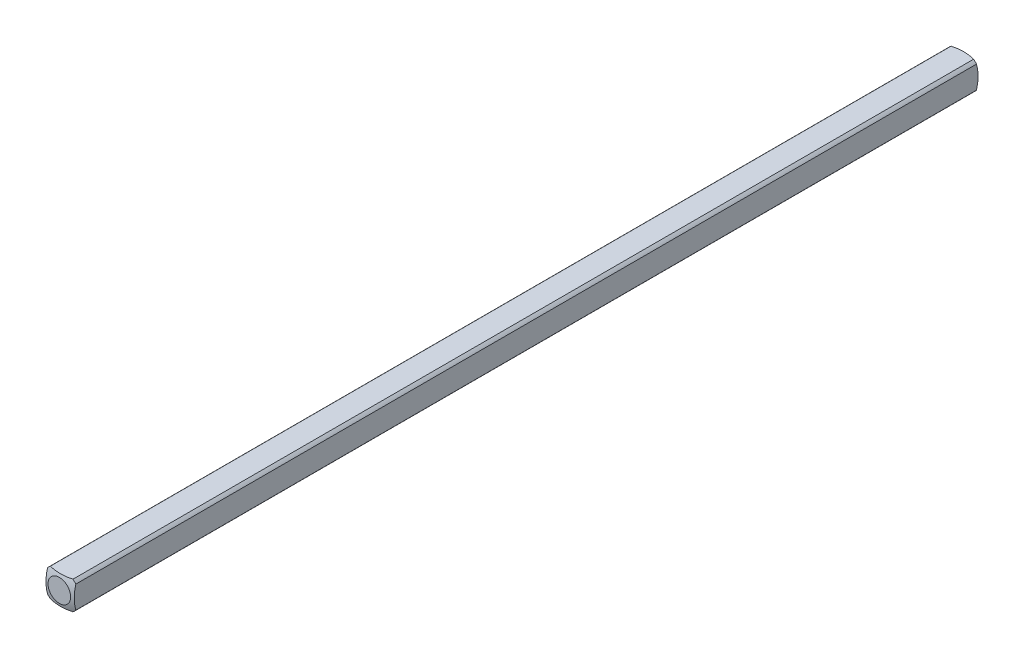
ISO-10303-21;
HEADER;
FILE_DESCRIPTION(('STEP AP214'),'2;1');
FILE_NAME('part.step','',(''),(''),'','','');
FILE_SCHEMA(('AUTOMOTIVE_DESIGN { 1 0 10303 214 1 1 1 1 }'));
ENDSEC;
DATA;
#1=APPLICATION_CONTEXT('core data for automotive mechanical design processes');
#2=APPLICATION_PROTOCOL_DEFINITION('international standard','automotive_design',2000,#1);
#3=PRODUCT_CONTEXT('',#1,'mechanical');
#4=PRODUCT('Part','Part','',(#3));
#5=PRODUCT_RELATED_PRODUCT_CATEGORY('part','',(#4));
#6=PRODUCT_DEFINITION_FORMATION('','',#4);
#7=PRODUCT_DEFINITION_CONTEXT('part definition',#1,'design');
#8=PRODUCT_DEFINITION('design','',#6,#7);
#9=PRODUCT_DEFINITION_SHAPE('','',#8);
#10=(LENGTH_UNIT() NAMED_UNIT(*) SI_UNIT(.MILLI.,.METRE.));
#11=(NAMED_UNIT(*) PLANE_ANGLE_UNIT() SI_UNIT($,.RADIAN.));
#12=(NAMED_UNIT(*) SI_UNIT($,.STERADIAN.) SOLID_ANGLE_UNIT());
#13=UNCERTAINTY_MEASURE_WITH_UNIT(LENGTH_MEASURE(1.E-05),#10,'distance_accuracy_value','');
#14=(GEOMETRIC_REPRESENTATION_CONTEXT(3) GLOBAL_UNCERTAINTY_ASSIGNED_CONTEXT((#13)) GLOBAL_UNIT_ASSIGNED_CONTEXT((#10,
#11,#12)) REPRESENTATION_CONTEXT('',''));
#15=CARTESIAN_POINT('',(0.,0.,0.));
#16=DIRECTION('',(0.,0.,1.));
#17=DIRECTION('',(1.,0.,0.));
#18=AXIS2_PLACEMENT_3D('',#15,#16,#17);
#19=CARTESIAN_POINT('',(-1.5875,-1.5875,50.8));
#20=DIRECTION('',(1.,0.,0.));
#21=DIRECTION('',(0.,0.,-1.));
#22=AXIS2_PLACEMENT_3D('',#19,#20,#21);
#23=PLANE('',#22);
#24=CARTESIAN_POINT('',(-1.5875,0.,4.91912226376204));
#25=DIRECTION('',(1.,0.,0.));
#26=DIRECTION('',(0.,0.,-1.));
#27=AXIS2_PLACEMENT_3D('',#24,#25,#26);
#28=CIRCLE('',#27,4.82558221875869);
#29=CARTESIAN_POINT('',(-1.5875,-1.26841150657032,0.263225357686904));
#30=VERTEX_POINT('',#29);
#31=CARTESIAN_POINT('',(-1.5875,1.26841150657032,0.263225357686907));
#32=VERTEX_POINT('',#31);
#33=EDGE_CURVE('E50',#30,#32,#28,.T.);
#34=ORIENTED_EDGE('',*,*,#33,.F.);
#35=DIRECTION('',(0.,0.,-1.));
#36=VECTOR('',#35,1.);
#37=CARTESIAN_POINT('',(-1.5875,-1.26841150657032,50.8));
#38=LINE('',#37,#36);
#39=CARTESIAN_POINT('',(-1.5875,-1.26841150657032,101.336774642313));
#40=VERTEX_POINT('',#39);
#41=EDGE_CURVE('E43',#40,#30,#38,.T.);
#42=ORIENTED_EDGE('',*,*,#41,.F.);
#43=CARTESIAN_POINT('',(-1.5875,0.,96.680877736238));
#44=DIRECTION('',(-1.,0.,0.));
#45=DIRECTION('',(0.,0.,1.));
#46=AXIS2_PLACEMENT_3D('',#43,#44,#45);
#47=CIRCLE('',#46,4.82558221875869);
#48=CARTESIAN_POINT('',(-1.5875,1.26841150657032,101.336774642313));
#49=VERTEX_POINT('',#48);
#50=EDGE_CURVE('E126',#40,#49,#47,.T.);
#51=ORIENTED_EDGE('',*,*,#50,.T.);
#52=DIRECTION('',(0.,0.,-1.));
#53=VECTOR('',#52,1.);
#54=CARTESIAN_POINT('',(-1.5875,1.26841150657032,50.8));
#55=LINE('',#54,#53);
#56=EDGE_CURVE('E114',#32,#49,#55,.F.);
#57=ORIENTED_EDGE('',*,*,#56,.F.);
#58=EDGE_LOOP('',(#34,#42,#51,#57));
#59=FACE_BOUND('',#58,.T.);
#60=ADVANCED_FACE('F36',(#59),#23,.F.);
#61=CARTESIAN_POINT('',(-1.5875,-1.5875,50.8));
#62=DIRECTION('',(0.,1.,0.));
#63=DIRECTION('',(0.,0.,1.));
#64=AXIS2_PLACEMENT_3D('',#61,#62,#63);
#65=PLANE('',#64);
#66=CARTESIAN_POINT('',(0.,-1.5875,4.91912226376204));
#67=DIRECTION('',(0.,1.,0.));
#68=DIRECTION('',(0.,0.,1.));
#69=AXIS2_PLACEMENT_3D('',#66,#67,#68);
#70=CIRCLE('',#69,4.82558221875869);
#71=CARTESIAN_POINT('',(1.26841150657032,-1.5875,0.263225357686905));
#72=VERTEX_POINT('',#71);
#73=CARTESIAN_POINT('',(-1.26841150657032,-1.5875,0.263225357686904));
#74=VERTEX_POINT('',#73);
#75=EDGE_CURVE('E155',#72,#74,#70,.T.);
#76=ORIENTED_EDGE('',*,*,#75,.F.);
#77=DIRECTION('',(0.,0.,-1.));
#78=VECTOR('',#77,1.);
#79=CARTESIAN_POINT('',(1.26841150657032,-1.5875,50.8));
#80=LINE('',#79,#78);
#81=CARTESIAN_POINT('',(1.26841150657032,-1.5875,101.336774642313));
#82=VERTEX_POINT('',#81);
#83=EDGE_CURVE('E168',#82,#72,#80,.T.);
#84=ORIENTED_EDGE('',*,*,#83,.F.);
#85=CARTESIAN_POINT('',(0.,-1.5875,96.680877736238));
#86=DIRECTION('',(0.,-1.,0.));
#87=DIRECTION('',(0.,0.,-1.));
#88=AXIS2_PLACEMENT_3D('',#85,#86,#87);
#89=CIRCLE('',#88,4.82558221875869);
#90=CARTESIAN_POINT('',(-1.26841150657032,-1.5875,101.336774642313));
#91=VERTEX_POINT('',#90);
#92=EDGE_CURVE('E137',#82,#91,#89,.T.);
#93=ORIENTED_EDGE('',*,*,#92,.T.);
#94=DIRECTION('',(0.,0.,-1.));
#95=VECTOR('',#94,1.);
#96=CARTESIAN_POINT('',(-1.26841150657032,-1.5875,50.8));
#97=LINE('',#96,#95);
#98=EDGE_CURVE('E166',#74,#91,#97,.F.);
#99=ORIENTED_EDGE('',*,*,#98,.F.);
#100=EDGE_LOOP('',(#76,#84,#93,#99));
#101=FACE_BOUND('',#100,.T.);
#102=ADVANCED_FACE('F178',(#101),#65,.F.);
#103=CARTESIAN_POINT('',(1.5875,-1.5875,50.8));
#104=DIRECTION('',(-1.,0.,0.));
#105=DIRECTION('',(0.,0.,1.));
#106=AXIS2_PLACEMENT_3D('',#103,#104,#105);
#107=PLANE('',#106);
#108=CARTESIAN_POINT('',(1.5875,0.,4.91912226376204));
#109=DIRECTION('',(-1.,0.,0.));
#110=DIRECTION('',(0.,0.,1.));
#111=AXIS2_PLACEMENT_3D('',#108,#109,#110);
#112=CIRCLE('',#111,4.82558221875869);
#113=CARTESIAN_POINT('',(1.5875,1.26841150657032,0.263225357686904));
#114=VERTEX_POINT('',#113);
#115=CARTESIAN_POINT('',(1.5875,-1.26841150657032,0.263225357686904));
#116=VERTEX_POINT('',#115);
#117=EDGE_CURVE('E153',#114,#116,#112,.T.);
#118=ORIENTED_EDGE('',*,*,#117,.F.);
#119=DIRECTION('',(0.,0.,-1.));
#120=VECTOR('',#119,1.);
#121=CARTESIAN_POINT('',(1.5875,1.26841150657032,50.8));
#122=LINE('',#121,#120);
#123=CARTESIAN_POINT('',(1.5875,1.26841150657032,101.336774642313));
#124=VERTEX_POINT('',#123);
#125=EDGE_CURVE('E163',#124,#114,#122,.T.);
#126=ORIENTED_EDGE('',*,*,#125,.F.);
#127=CARTESIAN_POINT('',(1.5875,0.,96.680877736238));
#128=DIRECTION('',(1.,0.,0.));
#129=DIRECTION('',(0.,0.,-1.));
#130=AXIS2_PLACEMENT_3D('',#127,#128,#129);
#131=CIRCLE('',#130,4.82558221875869);
#132=CARTESIAN_POINT('',(1.5875,-1.26841150657032,101.336774642313));
#133=VERTEX_POINT('',#132);
#134=EDGE_CURVE('E134',#124,#133,#131,.T.);
#135=ORIENTED_EDGE('',*,*,#134,.T.);
#136=DIRECTION('',(0.,0.,-1.));
#137=VECTOR('',#136,1.);
#138=CARTESIAN_POINT('',(1.5875,-1.26841150657032,50.8));
#139=LINE('',#138,#137);
#140=EDGE_CURVE('E107',#116,#133,#139,.F.);
#141=ORIENTED_EDGE('',*,*,#140,.F.);
#142=EDGE_LOOP('',(#118,#126,#135,#141));
#143=FACE_BOUND('',#142,.T.);
#144=ADVANCED_FACE('F185',(#143),#107,.F.);
#145=CARTESIAN_POINT('',(-1.5875,1.5875,50.8));
#146=DIRECTION('',(0.,-1.,0.));
#147=DIRECTION('',(0.,0.,-1.));
#148=AXIS2_PLACEMENT_3D('',#145,#146,#147);
#149=PLANE('',#148);
#150=CARTESIAN_POINT('',(0.,1.5875,4.91912226376204));
#151=DIRECTION('',(0.,-1.,0.));
#152=DIRECTION('',(0.,0.,-1.));
#153=AXIS2_PLACEMENT_3D('',#150,#151,#152);
#154=CIRCLE('',#153,4.82558221875869);
#155=CARTESIAN_POINT('',(-1.26841150657032,1.5875,0.263225357686904));
#156=VERTEX_POINT('',#155);
#157=CARTESIAN_POINT('',(1.26841150657032,1.5875,0.263225357686904));
#158=VERTEX_POINT('',#157);
#159=EDGE_CURVE('E105',#156,#158,#154,.T.);
#160=ORIENTED_EDGE('',*,*,#159,.F.);
#161=DIRECTION('',(0.,0.,-1.));
#162=VECTOR('',#161,1.);
#163=CARTESIAN_POINT('',(-1.26841150657032,1.5875,50.8));
#164=LINE('',#163,#162);
#165=CARTESIAN_POINT('',(-1.26841150657032,1.5875,101.336774642313));
#166=VERTEX_POINT('',#165);
#167=EDGE_CURVE('E99',#166,#156,#164,.T.);
#168=ORIENTED_EDGE('',*,*,#167,.F.);
#169=CARTESIAN_POINT('',(0.,1.5875,96.680877736238));
#170=DIRECTION('',(0.,1.,0.));
#171=DIRECTION('',(0.,0.,1.));
#172=AXIS2_PLACEMENT_3D('',#169,#170,#171);
#173=CIRCLE('',#172,4.82558221875869);
#174=CARTESIAN_POINT('',(1.26841150657032,1.5875,101.336774642313));
#175=VERTEX_POINT('',#174);
#176=EDGE_CURVE('E104',#166,#175,#173,.T.);
#177=ORIENTED_EDGE('',*,*,#176,.T.);
#178=DIRECTION('',(0.,0.,-1.));
#179=VECTOR('',#178,1.);
#180=CARTESIAN_POINT('',(1.26841150657032,1.5875,50.8));
#181=LINE('',#180,#179);
#182=EDGE_CURVE('E108',#158,#175,#181,.F.);
#183=ORIENTED_EDGE('',*,*,#182,.F.);
#184=EDGE_LOOP('',(#160,#168,#177,#183));
#185=FACE_BOUND('',#184,.T.);
#186=ADVANCED_FACE('F101',(#185),#149,.F.);
#187=CARTESIAN_POINT('',(0.,0.,50.8));
#188=DIRECTION('',(0.,0.,-1.));
#189=DIRECTION('',(-1.,0.,0.));
#190=AXIS2_PLACEMENT_3D('',#187,#188,#189);
#191=CYLINDRICAL_SURFACE('',#190,2.032);
#192=ORIENTED_EDGE('',*,*,#41,.T.);
#193=CARTESIAN_POINT('',(0.,0.,0.263225357686904));
#194=DIRECTION('',(0.,0.,1.));
#195=DIRECTION('',(1.,0.,0.));
#196=AXIS2_PLACEMENT_3D('',#193,#194,#195);
#197=CIRCLE('',#196,2.032);
#198=EDGE_CURVE('E150',#30,#74,#197,.T.);
#199=ORIENTED_EDGE('',*,*,#198,.T.);
#200=ORIENTED_EDGE('',*,*,#98,.T.);
#201=CARTESIAN_POINT('',(0.,0.,101.336774642313));
#202=DIRECTION('',(0.,0.,1.));
#203=DIRECTION('',(1.,0.,0.));
#204=AXIS2_PLACEMENT_3D('',#201,#202,#203);
#205=CIRCLE('',#204,2.032);
#206=EDGE_CURVE('E131',#40,#91,#205,.T.);
#207=ORIENTED_EDGE('',*,*,#206,.F.);
#208=EDGE_LOOP('',(#192,#199,#200,#207));
#209=FACE_BOUND('',#208,.T.);
#210=ADVANCED_FACE('F174',(#209),#191,.T.);
#211=ORIENTED_EDGE('',*,*,#83,.T.);
#212=CARTESIAN_POINT('',(0.,0.,0.263225357686904));
#213=DIRECTION('',(0.,0.,1.));
#214=DIRECTION('',(1.,0.,0.));
#215=AXIS2_PLACEMENT_3D('',#212,#213,#214);
#216=CIRCLE('',#215,2.032);
#217=EDGE_CURVE('E56',#72,#116,#216,.T.);
#218=ORIENTED_EDGE('',*,*,#217,.T.);
#219=ORIENTED_EDGE('',*,*,#140,.T.);
#220=CARTESIAN_POINT('',(0.,0.,101.336774642313));
#221=DIRECTION('',(0.,0.,1.));
#222=DIRECTION('',(1.,0.,0.));
#223=AXIS2_PLACEMENT_3D('',#220,#221,#222);
#224=CIRCLE('',#223,2.032);
#225=EDGE_CURVE('E140',#82,#133,#224,.T.);
#226=ORIENTED_EDGE('',*,*,#225,.F.);
#227=EDGE_LOOP('',(#211,#218,#219,#226));
#228=FACE_BOUND('',#227,.T.);
#229=ADVANCED_FACE('F181',(#228),#191,.T.);
#230=ORIENTED_EDGE('',*,*,#125,.T.);
#231=CARTESIAN_POINT('',(0.,0.,0.263225357686904));
#232=DIRECTION('',(0.,0.,1.));
#233=DIRECTION('',(1.,0.,0.));
#234=AXIS2_PLACEMENT_3D('',#231,#232,#233);
#235=CIRCLE('',#234,2.032);
#236=EDGE_CURVE('E147',#114,#158,#235,.T.);
#237=ORIENTED_EDGE('',*,*,#236,.T.);
#238=ORIENTED_EDGE('',*,*,#182,.T.);
#239=CARTESIAN_POINT('',(0.,0.,101.336774642313));
#240=DIRECTION('',(0.,0.,1.));
#241=DIRECTION('',(1.,0.,0.));
#242=AXIS2_PLACEMENT_3D('',#239,#240,#241);
#243=CIRCLE('',#242,2.032);
#244=EDGE_CURVE('E125',#124,#175,#243,.T.);
#245=ORIENTED_EDGE('',*,*,#244,.F.);
#246=EDGE_LOOP('',(#230,#237,#238,#245));
#247=FACE_BOUND('',#246,.T.);
#248=ADVANCED_FACE('F187',(#247),#191,.T.);
#249=ORIENTED_EDGE('',*,*,#167,.T.);
#250=CARTESIAN_POINT('',(0.,0.,0.263225357686904));
#251=DIRECTION('',(0.,0.,1.));
#252=DIRECTION('',(1.,0.,0.));
#253=AXIS2_PLACEMENT_3D('',#250,#251,#252);
#254=CIRCLE('',#253,2.032);
#255=EDGE_CURVE('E12',#156,#32,#254,.T.);
#256=ORIENTED_EDGE('',*,*,#255,.T.);
#257=ORIENTED_EDGE('',*,*,#56,.T.);
#258=CARTESIAN_POINT('',(0.,0.,101.336774642313));
#259=DIRECTION('',(0.,0.,1.));
#260=DIRECTION('',(1.,0.,0.));
#261=AXIS2_PLACEMENT_3D('',#258,#259,#260);
#262=CIRCLE('',#261,2.032);
#263=EDGE_CURVE('E111',#166,#49,#262,.T.);
#264=ORIENTED_EDGE('',*,*,#263,.F.);
#265=EDGE_LOOP('',(#249,#256,#257,#264));
#266=FACE_BOUND('',#265,.T.);
#267=ADVANCED_FACE('F112',(#266),#191,.T.);
#268=CARTESIAN_POINT('',(0.,0.,4.91912226376204));
#269=DIRECTION('',(0.,0.,1.));
#270=DIRECTION('',(-1.,0.,0.));
#271=AXIS2_PLACEMENT_3D('',#268,#269,#270);
#272=SPHERICAL_SURFACE('',#271,5.08);
#273=CARTESIAN_POINT('',(0.,0.,0.));
#274=DIRECTION('',(0.,0.,-1.));
#275=DIRECTION('',(-1.,0.,0.));
#276=AXIS2_PLACEMENT_3D('',#273,#274,#275);
#277=CIRCLE('',#276,1.26832020963187);
#278=CARTESIAN_POINT('',(-1.26832020963187,0.,0.));
#279=VERTEX_POINT('',#278);
#280=EDGE_CURVE('E158',#279,#279,#277,.T.);
#281=ORIENTED_EDGE('',*,*,#280,.F.);
#282=EDGE_LOOP('',(#281));
#283=FACE_BOUND('',#282,.T.);
#284=ORIENTED_EDGE('',*,*,#75,.T.);
#285=ORIENTED_EDGE('',*,*,#198,.F.);
#286=ORIENTED_EDGE('',*,*,#33,.T.);
#287=ORIENTED_EDGE('',*,*,#255,.F.);
#288=ORIENTED_EDGE('',*,*,#159,.T.);
#289=ORIENTED_EDGE('',*,*,#236,.F.);
#290=ORIENTED_EDGE('',*,*,#117,.T.);
#291=ORIENTED_EDGE('',*,*,#217,.F.);
#292=EDGE_LOOP('',(#284,#285,#286,#287,#288,#289,#290,#291));
#293=FACE_BOUND('',#292,.T.);
#294=ADVANCED_FACE('F188',(#283,#293),#272,.T.);
#295=CARTESIAN_POINT('',(0.,0.,0.));
#296=DIRECTION('',(0.,0.,-1.));
#297=DIRECTION('',(-1.,0.,0.));
#298=AXIS2_PLACEMENT_3D('',#295,#296,#297);
#299=PLANE('',#298);
#300=ORIENTED_EDGE('',*,*,#280,.T.);
#301=EDGE_LOOP('',(#300));
#302=FACE_BOUND('',#301,.T.);
#303=ADVANCED_FACE('F190',(#302),#299,.T.);
#304=CARTESIAN_POINT('',(0.,0.,96.680877736238));
#305=DIRECTION('',(0.,0.,-1.));
#306=DIRECTION('',(-1.,0.,0.));
#307=AXIS2_PLACEMENT_3D('',#304,#305,#306);
#308=SPHERICAL_SURFACE('',#307,5.08);
#309=CARTESIAN_POINT('',(0.,0.,101.6));
#310=DIRECTION('',(0.,0.,-1.));
#311=DIRECTION('',(-1.,0.,0.));
#312=AXIS2_PLACEMENT_3D('',#309,#310,#311);
#313=CIRCLE('',#312,1.26832020963187);
#314=CARTESIAN_POINT('',(-1.26832020963187,0.,101.6));
#315=VERTEX_POINT('',#314);
#316=EDGE_CURVE('E118',#315,#315,#313,.T.);
#317=ORIENTED_EDGE('',*,*,#316,.T.);
#318=EDGE_LOOP('',(#317));
#319=FACE_BOUND('',#318,.T.);
#320=ORIENTED_EDGE('',*,*,#92,.F.);
#321=ORIENTED_EDGE('',*,*,#225,.T.);
#322=ORIENTED_EDGE('',*,*,#134,.F.);
#323=ORIENTED_EDGE('',*,*,#244,.T.);
#324=ORIENTED_EDGE('',*,*,#176,.F.);
#325=ORIENTED_EDGE('',*,*,#263,.T.);
#326=ORIENTED_EDGE('',*,*,#50,.F.);
#327=ORIENTED_EDGE('',*,*,#206,.T.);
#328=EDGE_LOOP('',(#320,#321,#322,#323,#324,#325,#326,#327));
#329=FACE_BOUND('',#328,.T.);
#330=ADVANCED_FACE('F122',(#319,#329),#308,.T.);
#331=CARTESIAN_POINT('',(0.,0.,101.6));
#332=DIRECTION('',(0.,0.,1.));
#333=DIRECTION('',(-1.,0.,0.));
#334=AXIS2_PLACEMENT_3D('',#331,#332,#333);
#335=PLANE('',#334);
#336=ORIENTED_EDGE('',*,*,#316,.F.);
#337=EDGE_LOOP('',(#336));
#338=FACE_BOUND('',#337,.T.);
#339=ADVANCED_FACE('F235',(#338),#335,.T.);
#340=CLOSED_SHELL('',(#60,#102,#144,#186,#210,#229,#248,#267,#294,#303,#330,#339));
#341=MANIFOLD_SOLID_BREP('B2',#340);
#342=ADVANCED_BREP_SHAPE_REPRESENTATION('',(#18,#341),#14);
#343=SHAPE_DEFINITION_REPRESENTATION(#9,#342);
ENDSEC;
END-ISO-10303-21;
